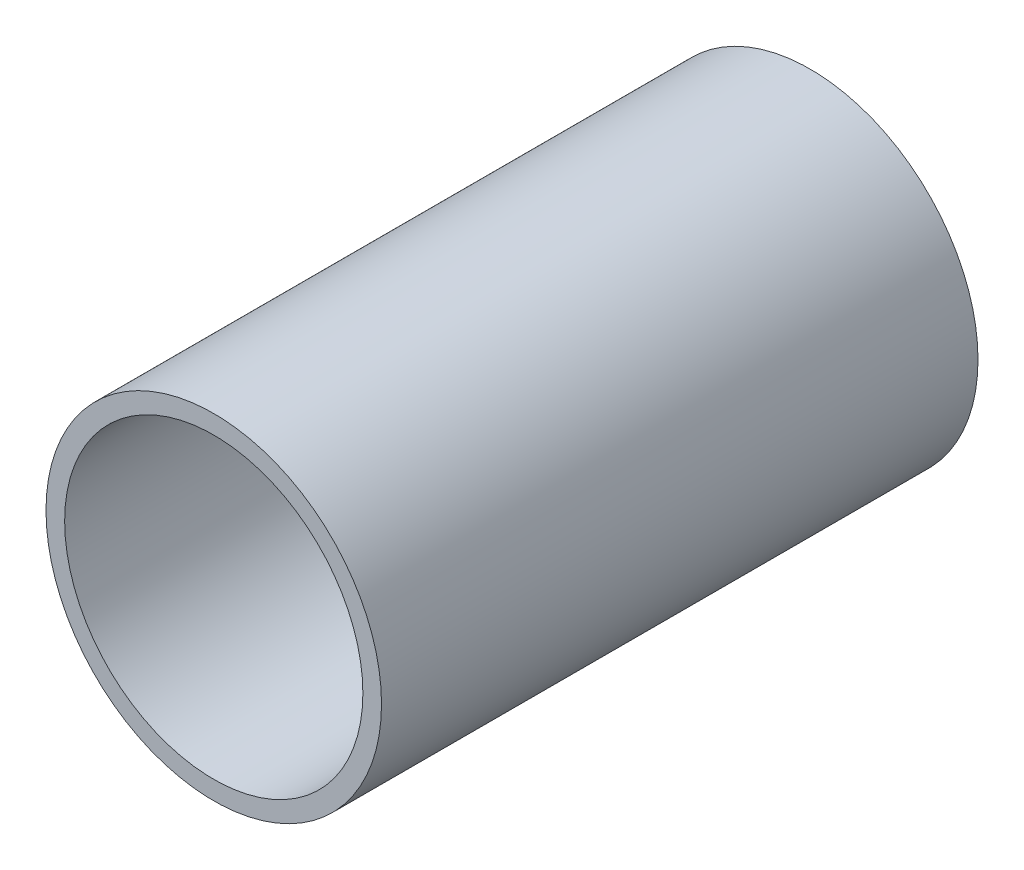
ISO-10303-21;
HEADER;
FILE_DESCRIPTION(('STEP AP214'),'2;1');
FILE_NAME('part.step','',(''),(''),'','','');
FILE_SCHEMA(('AUTOMOTIVE_DESIGN { 1 0 10303 214 1 1 1 1 }'));
ENDSEC;
DATA;
#1=APPLICATION_CONTEXT('core data for automotive mechanical design processes');
#2=APPLICATION_PROTOCOL_DEFINITION('international standard','automotive_design',2000,#1);
#3=PRODUCT_CONTEXT('',#1,'mechanical');
#4=PRODUCT('Part','Part','',(#3));
#5=PRODUCT_RELATED_PRODUCT_CATEGORY('part','',(#4));
#6=PRODUCT_DEFINITION_FORMATION('','',#4);
#7=PRODUCT_DEFINITION_CONTEXT('part definition',#1,'design');
#8=PRODUCT_DEFINITION('design','',#6,#7);
#9=PRODUCT_DEFINITION_SHAPE('','',#8);
#10=(LENGTH_UNIT() NAMED_UNIT(*) SI_UNIT(.MILLI.,.METRE.));
#11=(NAMED_UNIT(*) PLANE_ANGLE_UNIT() SI_UNIT($,.RADIAN.));
#12=(NAMED_UNIT(*) SI_UNIT($,.STERADIAN.) SOLID_ANGLE_UNIT());
#13=UNCERTAINTY_MEASURE_WITH_UNIT(LENGTH_MEASURE(1.E-05),#10,'distance_accuracy_value','');
#14=(GEOMETRIC_REPRESENTATION_CONTEXT(3) GLOBAL_UNCERTAINTY_ASSIGNED_CONTEXT((#13)) GLOBAL_UNIT_ASSIGNED_CONTEXT((#10,
#11,#12)) REPRESENTATION_CONTEXT('',''));
#15=CARTESIAN_POINT('',(0.,0.,0.));
#16=DIRECTION('',(0.,0.,1.));
#17=DIRECTION('',(1.,0.,0.));
#18=AXIS2_PLACEMENT_3D('',#15,#16,#17);
#19=CARTESIAN_POINT('',(0.,0.,203.2));
#20=DIRECTION('',(0.,0.,1.));
#21=DIRECTION('',(1.,0.,0.));
#22=AXIS2_PLACEMENT_3D('',#19,#20,#21);
#23=PLANE('',#22);
#24=CARTESIAN_POINT('',(0.,0.,203.2));
#25=DIRECTION('',(0.,0.,1.));
#26=DIRECTION('',(1.,0.,0.));
#27=AXIS2_PLACEMENT_3D('',#24,#25,#26);
#28=CIRCLE('',#27,57.15);
#29=CARTESIAN_POINT('',(57.15,0.,203.2));
#30=VERTEX_POINT('',#29);
#31=EDGE_CURVE('E10',#30,#30,#28,.T.);
#32=ORIENTED_EDGE('',*,*,#31,.T.);
#33=EDGE_LOOP('',(#32));
#34=FACE_BOUND('',#33,.T.);
#35=CARTESIAN_POINT('',(0.,0.,203.2));
#36=DIRECTION('',(0.,0.,1.));
#37=DIRECTION('',(1.,0.,0.));
#38=AXIS2_PLACEMENT_3D('',#35,#36,#37);
#39=CIRCLE('',#38,50.8);
#40=CARTESIAN_POINT('',(50.8,0.,203.2));
#41=VERTEX_POINT('',#40);
#42=EDGE_CURVE('E45',#41,#41,#39,.T.);
#43=ORIENTED_EDGE('',*,*,#42,.F.);
#44=EDGE_LOOP('',(#43));
#45=FACE_BOUND('',#44,.T.);
#46=ADVANCED_FACE('F34',(#34,#45),#23,.T.);
#47=CARTESIAN_POINT('',(0.,0.,0.));
#48=DIRECTION('',(0.,0.,1.));
#49=DIRECTION('',(1.,0.,0.));
#50=AXIS2_PLACEMENT_3D('',#47,#48,#49);
#51=PLANE('',#50);
#52=CARTESIAN_POINT('',(0.,0.,0.));
#53=DIRECTION('',(0.,0.,1.));
#54=DIRECTION('',(1.,0.,0.));
#55=AXIS2_PLACEMENT_3D('',#52,#53,#54);
#56=CIRCLE('',#55,57.15);
#57=CARTESIAN_POINT('',(57.15,0.,0.));
#58=VERTEX_POINT('',#57);
#59=EDGE_CURVE('E38',#58,#58,#56,.T.);
#60=ORIENTED_EDGE('',*,*,#59,.F.);
#61=EDGE_LOOP('',(#60));
#62=FACE_BOUND('',#61,.T.);
#63=CARTESIAN_POINT('',(0.,0.,0.));
#64=DIRECTION('',(0.,0.,1.));
#65=DIRECTION('',(1.,0.,0.));
#66=AXIS2_PLACEMENT_3D('',#63,#64,#65);
#67=CIRCLE('',#66,50.8);
#68=CARTESIAN_POINT('',(50.8,0.,0.));
#69=VERTEX_POINT('',#68);
#70=EDGE_CURVE('E47',#69,#69,#67,.T.);
#71=ORIENTED_EDGE('',*,*,#70,.T.);
#72=EDGE_LOOP('',(#71));
#73=FACE_BOUND('',#72,.T.);
#74=ADVANCED_FACE('F57',(#62,#73),#51,.F.);
#75=CARTESIAN_POINT('',(0.,0.,203.2));
#76=DIRECTION('',(0.,0.,-1.));
#77=DIRECTION('',(-1.,0.,0.));
#78=AXIS2_PLACEMENT_3D('',#75,#76,#77);
#79=CYLINDRICAL_SURFACE('',#78,57.15);
#80=ORIENTED_EDGE('',*,*,#31,.F.);
#81=EDGE_LOOP('',(#80));
#82=FACE_BOUND('',#81,.T.);
#83=ORIENTED_EDGE('',*,*,#59,.T.);
#84=EDGE_LOOP('',(#83));
#85=FACE_BOUND('',#84,.T.);
#86=ADVANCED_FACE('F36',(#82,#85),#79,.T.);
#87=CARTESIAN_POINT('',(0.,0.,203.2));
#88=DIRECTION('',(0.,0.,-1.));
#89=DIRECTION('',(-1.,0.,0.));
#90=AXIS2_PLACEMENT_3D('',#87,#88,#89);
#91=CYLINDRICAL_SURFACE('',#90,50.8);
#92=ORIENTED_EDGE('',*,*,#42,.T.);
#93=EDGE_LOOP('',(#92));
#94=FACE_BOUND('',#93,.T.);
#95=ORIENTED_EDGE('',*,*,#70,.F.);
#96=EDGE_LOOP('',(#95));
#97=FACE_BOUND('',#96,.T.);
#98=ADVANCED_FACE('F53',(#94,#97),#91,.F.);
#99=CLOSED_SHELL('',(#46,#74,#86,#98));
#100=MANIFOLD_SOLID_BREP('B2',#99);
#101=ADVANCED_BREP_SHAPE_REPRESENTATION('',(#18,#100),#14);
#102=SHAPE_DEFINITION_REPRESENTATION(#9,#101);
ENDSEC;
END-ISO-10303-21;
